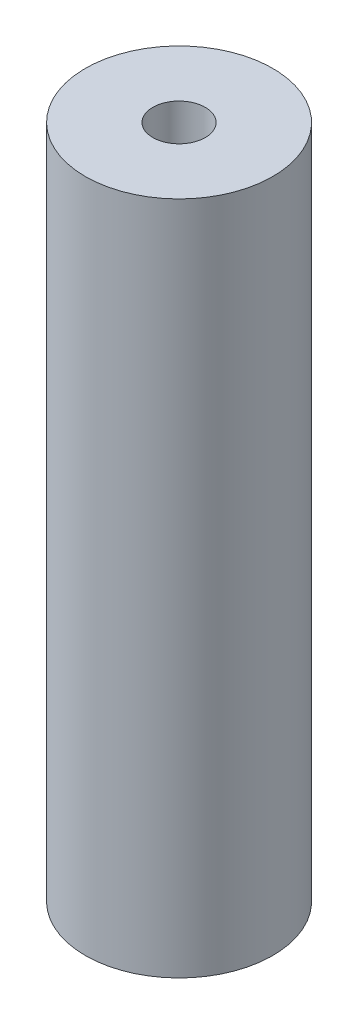
ISO-10303-21;
HEADER;
FILE_DESCRIPTION(('STEP AP214'),'2;1');
FILE_NAME('part.step','',(''),(''),'','','');
FILE_SCHEMA(('AUTOMOTIVE_DESIGN { 1 0 10303 214 1 1 1 1 }'));
ENDSEC;
DATA;
#1=APPLICATION_CONTEXT('core data for automotive mechanical design processes');
#2=APPLICATION_PROTOCOL_DEFINITION('international standard','automotive_design',2000,#1);
#3=PRODUCT_CONTEXT('',#1,'mechanical');
#4=PRODUCT('Part','Part','',(#3));
#5=PRODUCT_RELATED_PRODUCT_CATEGORY('part','',(#4));
#6=PRODUCT_DEFINITION_FORMATION('','',#4);
#7=PRODUCT_DEFINITION_CONTEXT('part definition',#1,'design');
#8=PRODUCT_DEFINITION('design','',#6,#7);
#9=PRODUCT_DEFINITION_SHAPE('','',#8);
#10=(LENGTH_UNIT() NAMED_UNIT(*) SI_UNIT(.MILLI.,.METRE.));
#11=(NAMED_UNIT(*) PLANE_ANGLE_UNIT() SI_UNIT($,.RADIAN.));
#12=(NAMED_UNIT(*) SI_UNIT($,.STERADIAN.) SOLID_ANGLE_UNIT());
#13=UNCERTAINTY_MEASURE_WITH_UNIT(LENGTH_MEASURE(1.E-05),#10,'distance_accuracy_value','');
#14=(GEOMETRIC_REPRESENTATION_CONTEXT(3) GLOBAL_UNCERTAINTY_ASSIGNED_CONTEXT((#13)) GLOBAL_UNIT_ASSIGNED_CONTEXT((#10,
#11,#12)) REPRESENTATION_CONTEXT('',''));
#15=CARTESIAN_POINT('',(0.,0.,0.));
#16=DIRECTION('',(0.,0.,1.));
#17=DIRECTION('',(1.,0.,0.));
#18=AXIS2_PLACEMENT_3D('',#15,#16,#17);
#19=CARTESIAN_POINT('',(0.,54.,0.));
#20=DIRECTION('',(0.,-1.,0.));
#21=DIRECTION('',(0.,0.,-1.));
#22=AXIS2_PLACEMENT_3D('',#19,#20,#21);
#23=CYLINDRICAL_SURFACE('',#22,7.5);
#24=CARTESIAN_POINT('',(0.,54.,0.));
#25=DIRECTION('',(0.,1.,0.));
#26=DIRECTION('',(0.,0.,1.));
#27=AXIS2_PLACEMENT_3D('',#24,#25,#26);
#28=CIRCLE('',#27,7.5);
#29=CARTESIAN_POINT('',(0.,54.,7.5));
#30=VERTEX_POINT('',#29);
#31=EDGE_CURVE('E11',#30,#30,#28,.T.);
#32=ORIENTED_EDGE('',*,*,#31,.F.);
#33=EDGE_LOOP('',(#32));
#34=FACE_BOUND('',#33,.T.);
#35=CARTESIAN_POINT('',(0.,0.,0.));
#36=DIRECTION('',(0.,1.,0.));
#37=DIRECTION('',(0.,0.,1.));
#38=AXIS2_PLACEMENT_3D('',#35,#36,#37);
#39=CIRCLE('',#38,7.5);
#40=CARTESIAN_POINT('',(0.,0.,7.5));
#41=VERTEX_POINT('',#40);
#42=EDGE_CURVE('E48',#41,#41,#39,.T.);
#43=ORIENTED_EDGE('',*,*,#42,.T.);
#44=EDGE_LOOP('',(#43));
#45=FACE_BOUND('',#44,.T.);
#46=ADVANCED_FACE('F45',(#34,#45),#23,.T.);
#47=CARTESIAN_POINT('',(0.,54.,0.));
#48=DIRECTION('',(0.,1.,0.));
#49=DIRECTION('',(0.,0.,1.));
#50=AXIS2_PLACEMENT_3D('',#47,#48,#49);
#51=PLANE('',#50);
#52=CARTESIAN_POINT('',(0.,54.,0.));
#53=DIRECTION('',(0.,1.,0.));
#54=DIRECTION('',(0.,0.,1.));
#55=AXIS2_PLACEMENT_3D('',#52,#53,#54);
#56=CIRCLE('',#55,2.09999999999999);
#57=CARTESIAN_POINT('',(0.,54.,2.09999999999999));
#58=VERTEX_POINT('',#57);
#59=EDGE_CURVE('E70',#58,#58,#56,.T.);
#60=ORIENTED_EDGE('',*,*,#59,.F.);
#61=EDGE_LOOP('',(#60));
#62=FACE_BOUND('',#61,.T.);
#63=ORIENTED_EDGE('',*,*,#31,.T.);
#64=EDGE_LOOP('',(#63));
#65=FACE_BOUND('',#64,.T.);
#66=ADVANCED_FACE('F93',(#62,#65),#51,.T.);
#67=CARTESIAN_POINT('',(0.,0.,0.));
#68=DIRECTION('',(0.,1.,0.));
#69=DIRECTION('',(0.,0.,1.));
#70=AXIS2_PLACEMENT_3D('',#67,#68,#69);
#71=PLANE('',#70);
#72=CARTESIAN_POINT('',(0.,0.,0.));
#73=DIRECTION('',(0.,-1.,0.));
#74=DIRECTION('',(0.,0.,-1.));
#75=AXIS2_PLACEMENT_3D('',#72,#73,#74);
#76=CIRCLE('',#75,2.09999999999999);
#77=CARTESIAN_POINT('',(0.,0.,-2.09999999999999));
#78=VERTEX_POINT('',#77);
#79=EDGE_CURVE('E71',#78,#78,#76,.T.);
#80=ORIENTED_EDGE('',*,*,#79,.F.);
#81=EDGE_LOOP('',(#80));
#82=FACE_BOUND('',#81,.T.);
#83=ORIENTED_EDGE('',*,*,#42,.F.);
#84=EDGE_LOOP('',(#83));
#85=FACE_BOUND('',#84,.T.);
#86=ADVANCED_FACE('F90',(#82,#85),#71,.F.);
#87=CARTESIAN_POINT('',(0.,41.6,0.));
#88=DIRECTION('',(0.,1.,0.));
#89=DIRECTION('',(0.,0.,1.));
#90=AXIS2_PLACEMENT_3D('',#87,#88,#89);
#91=CONICAL_SURFACE('',#90,2.1,1.02974425867665);
#92=CARTESIAN_POINT('',(0.,40.3381927000421,0.));
#93=VERTEX_POINT('',#92);
#94=VERTEX_LOOP('',#93);
#95=FACE_BOUND('',#94,.T.);
#96=CARTESIAN_POINT('',(0.,41.6,0.));
#97=DIRECTION('',(0.,1.,0.));
#98=DIRECTION('',(0.,0.,1.));
#99=AXIS2_PLACEMENT_3D('',#96,#97,#98);
#100=CIRCLE('',#99,2.1);
#101=CARTESIAN_POINT('',(0.,41.6,2.1));
#102=VERTEX_POINT('',#101);
#103=EDGE_CURVE('E76',#102,#102,#100,.T.);
#104=ORIENTED_EDGE('',*,*,#103,.T.);
#105=EDGE_LOOP('',(#104));
#106=FACE_BOUND('',#105,.T.);
#107=ADVANCED_FACE('F92',(#95,#106),#91,.F.);
#108=CARTESIAN_POINT('',(0.,54.,0.));
#109=DIRECTION('',(0.,1.,0.));
#110=DIRECTION('',(0.,0.,1.));
#111=AXIS2_PLACEMENT_3D('',#108,#109,#110);
#112=CYLINDRICAL_SURFACE('',#111,2.09999999999999);
#113=ORIENTED_EDGE('',*,*,#103,.F.);
#114=EDGE_LOOP('',(#113));
#115=FACE_BOUND('',#114,.T.);
#116=ORIENTED_EDGE('',*,*,#59,.T.);
#117=EDGE_LOOP('',(#116));
#118=FACE_BOUND('',#117,.T.);
#119=ADVANCED_FACE('F63',(#115,#118),#112,.F.);
#120=CARTESIAN_POINT('',(0.,12.4,0.));
#121=DIRECTION('',(0.,-1.,0.));
#122=DIRECTION('',(0.,0.,-1.));
#123=AXIS2_PLACEMENT_3D('',#120,#121,#122);
#124=CONICAL_SURFACE('',#123,2.1,1.02974425867665);
#125=CARTESIAN_POINT('',(0.,13.6618072999579,0.));
#126=VERTEX_POINT('',#125);
#127=VERTEX_LOOP('',#126);
#128=FACE_BOUND('',#127,.T.);
#129=CARTESIAN_POINT('',(0.,12.4,0.));
#130=DIRECTION('',(0.,-1.,0.));
#131=DIRECTION('',(0.,0.,-1.));
#132=AXIS2_PLACEMENT_3D('',#129,#130,#131);
#133=CIRCLE('',#132,2.1);
#134=CARTESIAN_POINT('',(0.,12.4,-2.1));
#135=VERTEX_POINT('',#134);
#136=EDGE_CURVE('E67',#135,#135,#133,.T.);
#137=ORIENTED_EDGE('',*,*,#136,.T.);
#138=EDGE_LOOP('',(#137));
#139=FACE_BOUND('',#138,.T.);
#140=ADVANCED_FACE('F59',(#128,#139),#124,.F.);
#141=CARTESIAN_POINT('',(0.,0.,0.));
#142=DIRECTION('',(0.,-1.,0.));
#143=DIRECTION('',(0.,0.,-1.));
#144=AXIS2_PLACEMENT_3D('',#141,#142,#143);
#145=CYLINDRICAL_SURFACE('',#144,2.09999999999999);
#146=ORIENTED_EDGE('',*,*,#136,.F.);
#147=EDGE_LOOP('',(#146));
#148=FACE_BOUND('',#147,.T.);
#149=ORIENTED_EDGE('',*,*,#79,.T.);
#150=EDGE_LOOP('',(#149));
#151=FACE_BOUND('',#150,.T.);
#152=ADVANCED_FACE('F62',(#148,#151),#145,.F.);
#153=CLOSED_SHELL('',(#46,#66,#86,#107,#119,#140,#152));
#154=MANIFOLD_SOLID_BREP('B2',#153);
#155=ADVANCED_BREP_SHAPE_REPRESENTATION('',(#18,#154),#14);
#156=SHAPE_DEFINITION_REPRESENTATION(#9,#155);
ENDSEC;
END-ISO-10303-21;
